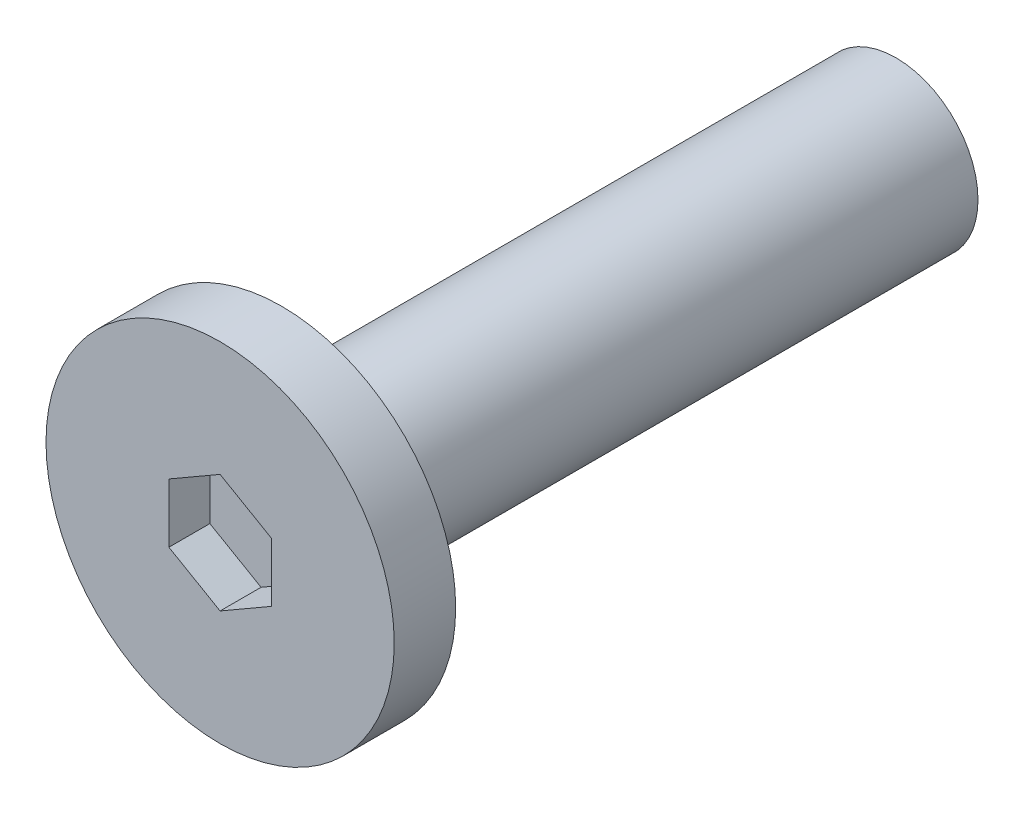
ISO-10303-21;
HEADER;
FILE_DESCRIPTION(('STEP AP214'),'2;1');
FILE_NAME('part.step','',(''),(''),'','','');
FILE_SCHEMA(('AUTOMOTIVE_DESIGN { 1 0 10303 214 1 1 1 1 }'));
ENDSEC;
DATA;
#1=APPLICATION_CONTEXT('core data for automotive mechanical design processes');
#2=APPLICATION_PROTOCOL_DEFINITION('international standard','automotive_design',2000,#1);
#3=PRODUCT_CONTEXT('',#1,'mechanical');
#4=PRODUCT('Part','Part','',(#3));
#5=PRODUCT_RELATED_PRODUCT_CATEGORY('part','',(#4));
#6=PRODUCT_DEFINITION_FORMATION('','',#4);
#7=PRODUCT_DEFINITION_CONTEXT('part definition',#1,'design');
#8=PRODUCT_DEFINITION('design','',#6,#7);
#9=PRODUCT_DEFINITION_SHAPE('','',#8);
#10=(LENGTH_UNIT() NAMED_UNIT(*) SI_UNIT(.MILLI.,.METRE.));
#11=(NAMED_UNIT(*) PLANE_ANGLE_UNIT() SI_UNIT($,.RADIAN.));
#12=(NAMED_UNIT(*) SI_UNIT($,.STERADIAN.) SOLID_ANGLE_UNIT());
#13=UNCERTAINTY_MEASURE_WITH_UNIT(LENGTH_MEASURE(1.E-05),#10,'distance_accuracy_value','');
#14=(GEOMETRIC_REPRESENTATION_CONTEXT(3) GLOBAL_UNCERTAINTY_ASSIGNED_CONTEXT((#13)) GLOBAL_UNIT_ASSIGNED_CONTEXT((#10,
#11,#12)) REPRESENTATION_CONTEXT('',''));
#15=CARTESIAN_POINT('',(0.,0.,0.));
#16=DIRECTION('',(0.,0.,1.));
#17=DIRECTION('',(1.,0.,0.));
#18=AXIS2_PLACEMENT_3D('',#15,#16,#17);
#19=CARTESIAN_POINT('',(45.8855643862837,144.956236842962,368.374757541018));
#20=DIRECTION('',(0.,0.,1.));
#21=DIRECTION('',(1.,0.,0.));
#22=AXIS2_PLACEMENT_3D('',#19,#20,#21);
#23=PLANE('',#22);
#24=DIRECTION('',(-0.866025403784439,-0.5,0.));
#25=VECTOR('',#24,1.);
#26=CARTESIAN_POINT('',(45.8855643862837,143.512861169988,368.374757541018));
#27=LINE('',#26,#25);
#28=CARTESIAN_POINT('',(47.1355643862837,144.234549006475,368.374757541018));
#29=VERTEX_POINT('',#28);
#30=CARTESIAN_POINT('',(45.8855643862837,143.512861169988,368.374757541018));
#31=VERTEX_POINT('',#30);
#32=EDGE_CURVE('E53',#29,#31,#27,.T.);
#33=ORIENTED_EDGE('',*,*,#32,.F.);
#34=DIRECTION('',(0.,-1.,0.));
#35=VECTOR('',#34,1.);
#36=CARTESIAN_POINT('',(47.1355643862837,144.234549006475,368.374757541018));
#37=LINE('',#36,#35);
#38=CARTESIAN_POINT('',(47.1355643862837,145.67792467945,368.374757541018));
#39=VERTEX_POINT('',#38);
#40=EDGE_CURVE('E119',#39,#29,#37,.T.);
#41=ORIENTED_EDGE('',*,*,#40,.F.);
#42=DIRECTION('',(-0.866025403784439,0.5,0.));
#43=VECTOR('',#42,1.);
#44=CARTESIAN_POINT('',(47.1355643862837,145.67792467945,368.374757541018));
#45=LINE('',#44,#43);
#46=CARTESIAN_POINT('',(45.8855643862837,146.399612515937,368.374757541018));
#47=VERTEX_POINT('',#46);
#48=EDGE_CURVE('E122',#39,#47,#45,.T.);
#49=ORIENTED_EDGE('',*,*,#48,.T.);
#50=DIRECTION('',(0.866025403784439,0.5,0.));
#51=VECTOR('',#50,1.);
#52=CARTESIAN_POINT('',(45.8855643862837,146.399612515937,368.374757541018));
#53=LINE('',#52,#51);
#54=CARTESIAN_POINT('',(44.6355643862837,145.67792467945,368.374757541018));
#55=VERTEX_POINT('',#54);
#56=EDGE_CURVE('E146',#55,#47,#53,.T.);
#57=ORIENTED_EDGE('',*,*,#56,.F.);
#58=DIRECTION('',(0.,-1.,0.));
#59=VECTOR('',#58,1.);
#60=CARTESIAN_POINT('',(44.6355643862837,145.67792467945,368.374757541018));
#61=LINE('',#60,#59);
#62=CARTESIAN_POINT('',(44.6355643862837,144.234549006475,368.374757541018));
#63=VERTEX_POINT('',#62);
#64=EDGE_CURVE('E192',#55,#63,#61,.T.);
#65=ORIENTED_EDGE('',*,*,#64,.T.);
#66=DIRECTION('',(-0.866025403784438,0.5,0.));
#67=VECTOR('',#66,1.);
#68=CARTESIAN_POINT('',(44.6355643862837,144.234549006475,368.374757541018));
#69=LINE('',#68,#67);
#70=EDGE_CURVE('E11',#31,#63,#69,.T.);
#71=ORIENTED_EDGE('',*,*,#70,.F.);
#72=EDGE_LOOP('',(#33,#41,#49,#57,#65,#71));
#73=FACE_BOUND('',#72,.T.);
#74=ADVANCED_FACE('F42',(#73),#23,.T.);
#75=CARTESIAN_POINT('',(44.6355643862837,144.234549006475,354.174757541018));
#76=DIRECTION('',(0.5,0.866025403784438,0.));
#77=DIRECTION('',(0.,0.,-1.));
#78=AXIS2_PLACEMENT_3D('',#75,#76,#77);
#79=PLANE('',#78);
#80=DIRECTION('',(0.,0.,-1.));
#81=VECTOR('',#80,1.);
#82=CARTESIAN_POINT('',(44.6355643862837,144.234549006475,354.174757541018));
#83=LINE('',#82,#81);
#84=CARTESIAN_POINT('',(44.6355643862837,144.234549006475,369.374757541018));
#85=VERTEX_POINT('',#84);
#86=EDGE_CURVE('E188',#85,#63,#83,.T.);
#87=ORIENTED_EDGE('',*,*,#86,.F.);
#88=DIRECTION('',(0.866025403784438,-0.5,0.));
#89=VECTOR('',#88,1.);
#90=CARTESIAN_POINT('',(45.2605643862837,143.873705088232,369.374757541018));
#91=LINE('',#90,#89);
#92=CARTESIAN_POINT('',(45.8855643862837,143.512861169988,369.374757541018));
#93=VERTEX_POINT('',#92);
#94=EDGE_CURVE('E161',#85,#93,#91,.T.);
#95=ORIENTED_EDGE('',*,*,#94,.T.);
#96=DIRECTION('',(0.,0.,-1.));
#97=VECTOR('',#96,1.);
#98=CARTESIAN_POINT('',(45.8855643862837,143.512861169988,354.174757541018));
#99=LINE('',#98,#97);
#100=EDGE_CURVE('E129',#93,#31,#99,.T.);
#101=ORIENTED_EDGE('',*,*,#100,.T.);
#102=ORIENTED_EDGE('',*,*,#70,.T.);
#103=EDGE_LOOP('',(#87,#95,#101,#102));
#104=FACE_BOUND('',#103,.T.);
#105=ADVANCED_FACE('F235',(#104),#79,.T.);
#106=CARTESIAN_POINT('',(45.8855643862837,143.512861169988,354.174757541018));
#107=DIRECTION('',(-0.5,0.866025403784439,0.));
#108=DIRECTION('',(0.,0.,1.));
#109=AXIS2_PLACEMENT_3D('',#106,#107,#108);
#110=PLANE('',#109);
#111=ORIENTED_EDGE('',*,*,#100,.F.);
#112=DIRECTION('',(0.866025403784439,0.5,0.));
#113=VECTOR('',#112,1.);
#114=CARTESIAN_POINT('',(46.5105643862837,143.873705088232,369.374757541018));
#115=LINE('',#114,#113);
#116=CARTESIAN_POINT('',(47.1355643862837,144.234549006475,369.374757541018));
#117=VERTEX_POINT('',#116);
#118=EDGE_CURVE('E167',#93,#117,#115,.T.);
#119=ORIENTED_EDGE('',*,*,#118,.T.);
#120=DIRECTION('',(0.,0.,-1.));
#121=VECTOR('',#120,1.);
#122=CARTESIAN_POINT('',(47.1355643862837,144.234549006475,354.174757541018));
#123=LINE('',#122,#121);
#124=EDGE_CURVE('E130',#117,#29,#123,.T.);
#125=ORIENTED_EDGE('',*,*,#124,.T.);
#126=ORIENTED_EDGE('',*,*,#32,.T.);
#127=EDGE_LOOP('',(#111,#119,#125,#126));
#128=FACE_BOUND('',#127,.T.);
#129=ADVANCED_FACE('F240',(#128),#110,.T.);
#130=CARTESIAN_POINT('',(47.1355643862837,144.234549006475,354.174757541018));
#131=DIRECTION('',(-1.,0.,0.));
#132=DIRECTION('',(0.,0.,1.));
#133=AXIS2_PLACEMENT_3D('',#130,#131,#132);
#134=PLANE('',#133);
#135=ORIENTED_EDGE('',*,*,#124,.F.);
#136=DIRECTION('',(0.,1.,0.));
#137=VECTOR('',#136,1.);
#138=CARTESIAN_POINT('',(47.1355643862837,144.956236842962,369.374757541018));
#139=LINE('',#138,#137);
#140=CARTESIAN_POINT('',(47.1355643862837,145.67792467945,369.374757541018));
#141=VERTEX_POINT('',#140);
#142=EDGE_CURVE('E143',#117,#141,#139,.T.);
#143=ORIENTED_EDGE('',*,*,#142,.T.);
#144=DIRECTION('',(0.,0.,-1.));
#145=VECTOR('',#144,1.);
#146=CARTESIAN_POINT('',(47.1355643862837,145.67792467945,354.174757541018));
#147=LINE('',#146,#145);
#148=EDGE_CURVE('E137',#141,#39,#147,.T.);
#149=ORIENTED_EDGE('',*,*,#148,.T.);
#150=ORIENTED_EDGE('',*,*,#40,.T.);
#151=EDGE_LOOP('',(#135,#143,#149,#150));
#152=FACE_BOUND('',#151,.T.);
#153=ADVANCED_FACE('F141',(#152),#134,.T.);
#154=CARTESIAN_POINT('',(47.1355643862837,145.67792467945,354.174757541018));
#155=DIRECTION('',(-0.5,-0.866025403784439,0.));
#156=DIRECTION('',(-0.866025403784439,0.5,0.));
#157=AXIS2_PLACEMENT_3D('',#154,#155,#156);
#158=PLANE('',#157);
#159=ORIENTED_EDGE('',*,*,#148,.F.);
#160=DIRECTION('',(-0.866025403784439,0.5,0.));
#161=VECTOR('',#160,1.);
#162=CARTESIAN_POINT('',(46.5105643862837,146.038768597693,369.374757541018));
#163=LINE('',#162,#161);
#164=CARTESIAN_POINT('',(45.8855643862837,146.399612515937,369.374757541018));
#165=VERTEX_POINT('',#164);
#166=EDGE_CURVE('E162',#141,#165,#163,.T.);
#167=ORIENTED_EDGE('',*,*,#166,.T.);
#168=DIRECTION('',(0.,0.,-1.));
#169=VECTOR('',#168,1.);
#170=CARTESIAN_POINT('',(45.8855643862837,146.399612515937,354.174757541018));
#171=LINE('',#170,#169);
#172=EDGE_CURVE('E139',#165,#47,#171,.T.);
#173=ORIENTED_EDGE('',*,*,#172,.T.);
#174=ORIENTED_EDGE('',*,*,#48,.F.);
#175=EDGE_LOOP('',(#159,#167,#173,#174));
#176=FACE_BOUND('',#175,.T.);
#177=ADVANCED_FACE('F135',(#176),#158,.T.);
#178=CARTESIAN_POINT('',(45.8855643862837,146.399612515937,354.174757541018));
#179=DIRECTION('',(0.5,-0.866025403784439,0.));
#180=DIRECTION('',(0.,0.,-1.));
#181=AXIS2_PLACEMENT_3D('',#178,#179,#180);
#182=PLANE('',#181);
#183=ORIENTED_EDGE('',*,*,#172,.F.);
#184=DIRECTION('',(-0.866025403784439,-0.5,0.));
#185=VECTOR('',#184,1.);
#186=CARTESIAN_POINT('',(45.2605643862837,146.038768597693,369.374757541018));
#187=LINE('',#186,#185);
#188=CARTESIAN_POINT('',(44.6355643862837,145.67792467945,369.374757541018));
#189=VERTEX_POINT('',#188);
#190=EDGE_CURVE('E165',#165,#189,#187,.T.);
#191=ORIENTED_EDGE('',*,*,#190,.T.);
#192=DIRECTION('',(0.,0.,-1.));
#193=VECTOR('',#192,1.);
#194=CARTESIAN_POINT('',(44.6355643862837,145.67792467945,354.174757541018));
#195=LINE('',#194,#193);
#196=EDGE_CURVE('E155',#189,#55,#195,.T.);
#197=ORIENTED_EDGE('',*,*,#196,.T.);
#198=ORIENTED_EDGE('',*,*,#56,.T.);
#199=EDGE_LOOP('',(#183,#191,#197,#198));
#200=FACE_BOUND('',#199,.T.);
#201=ADVANCED_FACE('F255',(#200),#182,.T.);
#202=CARTESIAN_POINT('',(44.6355643862837,145.67792467945,354.174757541018));
#203=DIRECTION('',(1.,0.,0.));
#204=DIRECTION('',(0.,1.,0.));
#205=AXIS2_PLACEMENT_3D('',#202,#203,#204);
#206=PLANE('',#205);
#207=ORIENTED_EDGE('',*,*,#196,.F.);
#208=DIRECTION('',(0.,-1.,0.));
#209=VECTOR('',#208,1.);
#210=CARTESIAN_POINT('',(44.6355643862837,144.956236842962,369.374757541018));
#211=LINE('',#210,#209);
#212=EDGE_CURVE('E157',#189,#85,#211,.T.);
#213=ORIENTED_EDGE('',*,*,#212,.T.);
#214=ORIENTED_EDGE('',*,*,#86,.T.);
#215=ORIENTED_EDGE('',*,*,#64,.F.);
#216=EDGE_LOOP('',(#207,#213,#214,#215));
#217=FACE_BOUND('',#216,.T.);
#218=ADVANCED_FACE('F252',(#217),#206,.T.);
#219=CARTESIAN_POINT('',(45.8855643862837,144.956236842962,367.874757541018));
#220=DIRECTION('',(0.,0.,1.));
#221=DIRECTION('',(1.,0.,0.));
#222=AXIS2_PLACEMENT_3D('',#219,#220,#221);
#223=PLANE('',#222);
#224=CARTESIAN_POINT('',(45.8855643862837,144.956236842962,367.874757541018));
#225=DIRECTION('',(0.,0.,-1.));
#226=DIRECTION('',(-1.,0.,0.));
#227=AXIS2_PLACEMENT_3D('',#224,#225,#226);
#228=CIRCLE('',#227,4.25);
#229=CARTESIAN_POINT('',(41.6355643862837,144.956236842962,367.874757541018));
#230=VERTEX_POINT('',#229);
#231=EDGE_CURVE('E183',#230,#230,#228,.T.);
#232=ORIENTED_EDGE('',*,*,#231,.T.);
#233=EDGE_LOOP('',(#232));
#234=FACE_BOUND('',#233,.T.);
#235=CARTESIAN_POINT('',(45.8855643862837,144.956236842962,367.874757541018));
#236=DIRECTION('',(0.,0.,1.));
#237=DIRECTION('',(-1.,0.,0.));
#238=AXIS2_PLACEMENT_3D('',#235,#236,#237);
#239=CIRCLE('',#238,2.);
#240=CARTESIAN_POINT('',(43.8855643862837,144.956236842962,367.874757541018));
#241=VERTEX_POINT('',#240);
#242=EDGE_CURVE('E46',#241,#241,#239,.T.);
#243=ORIENTED_EDGE('',*,*,#242,.T.);
#244=EDGE_LOOP('',(#243));
#245=FACE_BOUND('',#244,.T.);
#246=ADVANCED_FACE('F245',(#234,#245),#223,.F.);
#247=CARTESIAN_POINT('',(45.8855643862837,144.956236842962,367.874757541018));
#248=DIRECTION('',(0.,0.,1.));
#249=DIRECTION('',(-1.,0.,0.));
#250=AXIS2_PLACEMENT_3D('',#247,#248,#249);
#251=CYLINDRICAL_SURFACE('',#250,4.25);
#252=CARTESIAN_POINT('',(45.8855643862837,144.956236842962,369.374757541018));
#253=DIRECTION('',(0.,0.,-1.));
#254=DIRECTION('',(-1.,0.,0.));
#255=AXIS2_PLACEMENT_3D('',#252,#253,#254);
#256=CIRCLE('',#255,4.25);
#257=CARTESIAN_POINT('',(41.6355643862837,144.956236842962,369.374757541018));
#258=VERTEX_POINT('',#257);
#259=EDGE_CURVE('E180',#258,#258,#256,.T.);
#260=ORIENTED_EDGE('',*,*,#259,.T.);
#261=EDGE_LOOP('',(#260));
#262=FACE_BOUND('',#261,.T.);
#263=ORIENTED_EDGE('',*,*,#231,.F.);
#264=EDGE_LOOP('',(#263));
#265=FACE_BOUND('',#264,.T.);
#266=ADVANCED_FACE('F44',(#262,#265),#251,.T.);
#267=CARTESIAN_POINT('',(45.8855643862837,144.956236842962,367.374757541018));
#268=DIRECTION('',(0.,0.,1.));
#269=DIRECTION('',(1.,0.,0.));
#270=AXIS2_PLACEMENT_3D('',#267,#268,#269);
#271=PLANE('',#270);
#272=CARTESIAN_POINT('',(45.8855643862837,144.956236842962,367.374757541018));
#273=DIRECTION('',(0.,0.,1.));
#274=DIRECTION('',(0.,1.,0.));
#275=AXIS2_PLACEMENT_3D('',#272,#273,#274);
#276=CIRCLE('',#275,1.5);
#277=CARTESIAN_POINT('',(45.8855643862837,146.456236842962,367.374757541018));
#278=VERTEX_POINT('',#277);
#279=EDGE_CURVE('E187',#278,#278,#276,.T.);
#280=ORIENTED_EDGE('',*,*,#279,.F.);
#281=EDGE_LOOP('',(#280));
#282=FACE_BOUND('',#281,.T.);
#283=ADVANCED_FACE('F250',(#282),#271,.F.);
#284=CARTESIAN_POINT('',(45.8855643862837,144.956236842962,367.374757541018));
#285=DIRECTION('',(0.,0.,-1.));
#286=DIRECTION('',(1.,0.,0.));
#287=AXIS2_PLACEMENT_3D('',#284,#285,#286);
#288=CYLINDRICAL_SURFACE('',#287,1.5);
#289=CARTESIAN_POINT('',(45.8855643862837,144.956236842962,352.874757541018));
#290=DIRECTION('',(0.,0.,1.));
#291=DIRECTION('',(1.,0.,0.));
#292=AXIS2_PLACEMENT_3D('',#289,#290,#291);
#293=CIRCLE('',#292,1.5);
#294=CARTESIAN_POINT('',(47.3855643862837,144.956236842962,352.874757541018));
#295=VERTEX_POINT('',#294);
#296=EDGE_CURVE('E85',#295,#295,#293,.T.);
#297=ORIENTED_EDGE('',*,*,#296,.F.);
#298=EDGE_LOOP('',(#297));
#299=FACE_BOUND('',#298,.T.);
#300=ORIENTED_EDGE('',*,*,#279,.T.);
#301=EDGE_LOOP('',(#300));
#302=FACE_BOUND('',#301,.T.);
#303=ADVANCED_FACE('F247',(#299,#302),#288,.F.);
#304=CARTESIAN_POINT('',(45.8855643862837,144.956236842962,352.874757541018));
#305=DIRECTION('',(0.,0.,-1.));
#306=DIRECTION('',(0.,-1.,0.));
#307=AXIS2_PLACEMENT_3D('',#304,#305,#306);
#308=PLANE('',#307);
#309=CARTESIAN_POINT('',(45.8855643862837,144.956236842962,352.874757541018));
#310=DIRECTION('',(0.,0.,-1.));
#311=DIRECTION('',(1.,0.,0.));
#312=AXIS2_PLACEMENT_3D('',#309,#310,#311);
#313=CIRCLE('',#312,2.);
#314=CARTESIAN_POINT('',(47.8855643862837,144.956236842962,352.874757541018));
#315=VERTEX_POINT('',#314);
#316=EDGE_CURVE('E160',#315,#315,#313,.T.);
#317=ORIENTED_EDGE('',*,*,#316,.T.);
#318=EDGE_LOOP('',(#317));
#319=FACE_BOUND('',#318,.T.);
#320=ORIENTED_EDGE('',*,*,#296,.T.);
#321=EDGE_LOOP('',(#320));
#322=FACE_BOUND('',#321,.T.);
#323=ADVANCED_FACE('F230',(#319,#322),#308,.T.);
#324=CARTESIAN_POINT('',(45.8855643862837,144.956236842962,359.374757541018));
#325=DIRECTION('',(0.,0.,1.));
#326=DIRECTION('',(-1.,0.,0.));
#327=AXIS2_PLACEMENT_3D('',#324,#325,#326);
#328=CYLINDRICAL_SURFACE('',#327,2.);
#329=ORIENTED_EDGE('',*,*,#242,.F.);
#330=EDGE_LOOP('',(#329));
#331=FACE_BOUND('',#330,.T.);
#332=ORIENTED_EDGE('',*,*,#316,.F.);
#333=EDGE_LOOP('',(#332));
#334=FACE_BOUND('',#333,.T.);
#335=ADVANCED_FACE('F224',(#331,#334),#328,.T.);
#336=CARTESIAN_POINT('',(45.8855643862837,144.956236842962,369.374757541018));
#337=DIRECTION('',(0.,0.,1.));
#338=DIRECTION('',(1.,0.,0.));
#339=AXIS2_PLACEMENT_3D('',#336,#337,#338);
#340=PLANE('',#339);
#341=ORIENTED_EDGE('',*,*,#190,.F.);
#342=ORIENTED_EDGE('',*,*,#166,.F.);
#343=ORIENTED_EDGE('',*,*,#142,.F.);
#344=ORIENTED_EDGE('',*,*,#118,.F.);
#345=ORIENTED_EDGE('',*,*,#94,.F.);
#346=ORIENTED_EDGE('',*,*,#212,.F.);
#347=EDGE_LOOP('',(#341,#342,#343,#344,#345,#346));
#348=FACE_BOUND('',#347,.T.);
#349=ORIENTED_EDGE('',*,*,#259,.F.);
#350=EDGE_LOOP('',(#349));
#351=FACE_BOUND('',#350,.T.);
#352=ADVANCED_FACE('F222',(#348,#351),#340,.T.);
#353=CLOSED_SHELL('',(#74,#105,#129,#153,#177,#201,#218,#246,#266,#283,#303,#323,#335,#352));
#354=MANIFOLD_SOLID_BREP('B2',#353);
#355=ADVANCED_BREP_SHAPE_REPRESENTATION('',(#18,#354),#14);
#356=SHAPE_DEFINITION_REPRESENTATION(#9,#355);
ENDSEC;
END-ISO-10303-21;
